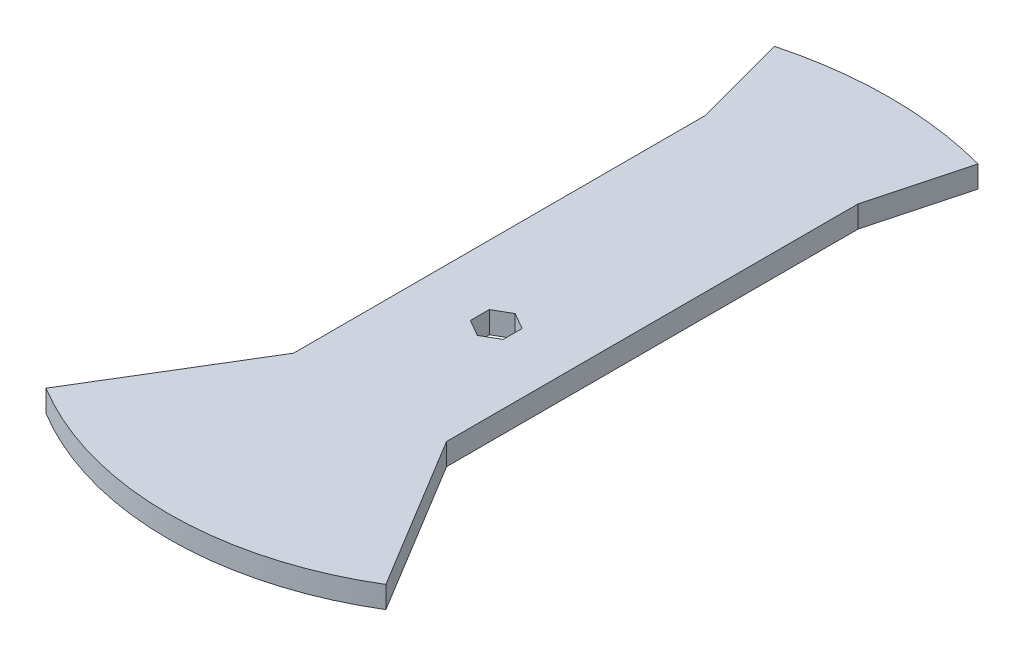
ISO-10303-21;
HEADER;
FILE_DESCRIPTION(('STEP AP214'),'2;1');
FILE_NAME('part.step','',(''),(''),'','','');
FILE_SCHEMA(('AUTOMOTIVE_DESIGN { 1 0 10303 214 1 1 1 1 }'));
ENDSEC;
DATA;
#1=APPLICATION_CONTEXT('core data for automotive mechanical design processes');
#2=APPLICATION_PROTOCOL_DEFINITION('international standard','automotive_design',2000,#1);
#3=PRODUCT_CONTEXT('',#1,'mechanical');
#4=PRODUCT('Part','Part','',(#3));
#5=PRODUCT_RELATED_PRODUCT_CATEGORY('part','',(#4));
#6=PRODUCT_DEFINITION_FORMATION('','',#4);
#7=PRODUCT_DEFINITION_CONTEXT('part definition',#1,'design');
#8=PRODUCT_DEFINITION('design','',#6,#7);
#9=PRODUCT_DEFINITION_SHAPE('','',#8);
#10=(LENGTH_UNIT() NAMED_UNIT(*) SI_UNIT(.MILLI.,.METRE.));
#11=(NAMED_UNIT(*) PLANE_ANGLE_UNIT() SI_UNIT($,.RADIAN.));
#12=(NAMED_UNIT(*) SI_UNIT($,.STERADIAN.) SOLID_ANGLE_UNIT());
#13=UNCERTAINTY_MEASURE_WITH_UNIT(LENGTH_MEASURE(1.E-05),#10,'distance_accuracy_value','');
#14=(GEOMETRIC_REPRESENTATION_CONTEXT(3) GLOBAL_UNCERTAINTY_ASSIGNED_CONTEXT((#13)) GLOBAL_UNIT_ASSIGNED_CONTEXT((#10,
#11,#12)) REPRESENTATION_CONTEXT('',''));
#15=CARTESIAN_POINT('',(0.,0.,0.));
#16=DIRECTION('',(0.,0.,1.));
#17=DIRECTION('',(1.,0.,0.));
#18=AXIS2_PLACEMENT_3D('',#15,#16,#17);
#19=CARTESIAN_POINT('',(0.,3.175,0.));
#20=DIRECTION('',(0.,-1.,0.));
#21=DIRECTION('',(0.,0.,-1.));
#22=AXIS2_PLACEMENT_3D('',#19,#20,#21);
#23=CYLINDRICAL_SURFACE('',#22,114.3);
#24=CARTESIAN_POINT('',(0.,-3.175,0.));
#25=DIRECTION('',(0.,1.,0.));
#26=DIRECTION('',(0.,0.,-1.));
#27=AXIS2_PLACEMENT_3D('',#24,#25,#26);
#28=CIRCLE('',#27,114.3);
#29=CARTESIAN_POINT('',(29.5830168552182,-3.175,-110.405321944841));
#30=VERTEX_POINT('',#29);
#31=CARTESIAN_POINT('',(-29.5830168552182,-3.175,-110.40532194484));
#32=VERTEX_POINT('',#31);
#33=EDGE_CURVE('E141',#30,#32,#28,.T.);
#34=ORIENTED_EDGE('',*,*,#33,.T.);
#35=DIRECTION('',(0.,-1.,0.));
#36=VECTOR('',#35,1.);
#37=CARTESIAN_POINT('',(-29.5830168552182,3.175,-110.40532194484));
#38=LINE('',#37,#36);
#39=CARTESIAN_POINT('',(-29.5830168552182,3.175,-110.40532194484));
#40=VERTEX_POINT('',#39);
#41=EDGE_CURVE('E11',#40,#32,#38,.T.);
#42=ORIENTED_EDGE('',*,*,#41,.F.);
#43=CARTESIAN_POINT('',(0.,3.175,0.));
#44=DIRECTION('',(0.,1.,0.));
#45=DIRECTION('',(0.,0.,-1.));
#46=AXIS2_PLACEMENT_3D('',#43,#44,#45);
#47=CIRCLE('',#46,114.3);
#48=CARTESIAN_POINT('',(29.5830168552182,3.175,-110.405321944841));
#49=VERTEX_POINT('',#48);
#50=EDGE_CURVE('E181',#49,#40,#47,.T.);
#51=ORIENTED_EDGE('',*,*,#50,.F.);
#52=DIRECTION('',(0.,-1.,0.));
#53=VECTOR('',#52,1.);
#54=CARTESIAN_POINT('',(29.5830168552182,3.175,-110.405321944841));
#55=LINE('',#54,#53);
#56=EDGE_CURVE('E199',#49,#30,#55,.T.);
#57=ORIENTED_EDGE('',*,*,#56,.T.);
#58=EDGE_LOOP('',(#34,#42,#51,#57));
#59=FACE_BOUND('',#58,.T.);
#60=ADVANCED_FACE('F35',(#59),#23,.T.);
#61=CARTESIAN_POINT('',(-29.5830168552182,3.175,-110.40532194484));
#62=DIRECTION('',(0.965925826289068,0.,-0.258819045102522));
#63=DIRECTION('',(-0.258819045102522,0.,-0.965925826289068));
#64=AXIS2_PLACEMENT_3D('',#61,#62,#63);
#65=PLANE('',#64);
#66=DIRECTION('',(0.258819045102522,0.,0.965925826289068));
#67=VECTOR('',#66,1.);
#68=CARTESIAN_POINT('',(-29.5830168552182,-3.175,-110.40532194484));
#69=LINE('',#68,#67);
#70=CARTESIAN_POINT('',(-22.225,-3.175,-82.944829198218));
#71=VERTEX_POINT('',#70);
#72=EDGE_CURVE('E202',#32,#71,#69,.T.);
#73=ORIENTED_EDGE('',*,*,#72,.T.);
#74=DIRECTION('',(0.,-1.,0.));
#75=VECTOR('',#74,1.);
#76=CARTESIAN_POINT('',(-22.225,3.175,-82.944829198218));
#77=LINE('',#76,#75);
#78=CARTESIAN_POINT('',(-22.225,3.175,-82.944829198218));
#79=VERTEX_POINT('',#78);
#80=EDGE_CURVE('E42',#79,#71,#77,.T.);
#81=ORIENTED_EDGE('',*,*,#80,.F.);
#82=DIRECTION('',(0.258819045102522,0.,0.965925826289068));
#83=VECTOR('',#82,1.);
#84=CARTESIAN_POINT('',(-29.5830168552182,3.175,-110.40532194484));
#85=LINE('',#84,#83);
#86=EDGE_CURVE('E184',#40,#79,#85,.T.);
#87=ORIENTED_EDGE('',*,*,#86,.F.);
#88=ORIENTED_EDGE('',*,*,#41,.T.);
#89=EDGE_LOOP('',(#73,#81,#87,#88));
#90=FACE_BOUND('',#89,.T.);
#91=ADVANCED_FACE('F257',(#90),#65,.F.);
#92=CARTESIAN_POINT('',(-22.225,3.175,-82.944829198218));
#93=DIRECTION('',(1.,0.,0.));
#94=DIRECTION('',(0.,0.,-1.));
#95=AXIS2_PLACEMENT_3D('',#92,#93,#94);
#96=PLANE('',#95);
#97=DIRECTION('',(0.,0.,1.));
#98=VECTOR('',#97,1.);
#99=CARTESIAN_POINT('',(-22.225,-3.175,-82.944829198218));
#100=LINE('',#99,#98);
#101=CARTESIAN_POINT('',(-22.225,-3.175,36.6590574958511));
#102=VERTEX_POINT('',#101);
#103=EDGE_CURVE('E204',#71,#102,#100,.T.);
#104=ORIENTED_EDGE('',*,*,#103,.T.);
#105=DIRECTION('',(0.,-1.,0.));
#106=VECTOR('',#105,1.);
#107=CARTESIAN_POINT('',(-22.225,3.175,36.6590574958511));
#108=LINE('',#107,#106);
#109=CARTESIAN_POINT('',(-22.225,3.175,36.6590574958511));
#110=VERTEX_POINT('',#109);
#111=EDGE_CURVE('E229',#110,#102,#108,.T.);
#112=ORIENTED_EDGE('',*,*,#111,.F.);
#113=DIRECTION('',(0.,0.,1.));
#114=VECTOR('',#113,1.);
#115=CARTESIAN_POINT('',(-22.225,3.175,-82.944829198218));
#116=LINE('',#115,#114);
#117=EDGE_CURVE('E187',#79,#110,#116,.T.);
#118=ORIENTED_EDGE('',*,*,#117,.F.);
#119=ORIENTED_EDGE('',*,*,#80,.T.);
#120=EDGE_LOOP('',(#104,#112,#118,#119));
#121=FACE_BOUND('',#120,.T.);
#122=ADVANCED_FACE('F236',(#121),#96,.F.);
#123=CARTESIAN_POINT('',(-22.225,3.175,36.6590574958511));
#124=DIRECTION('',(0.85512142026816,0.,0.51842777375307));
#125=DIRECTION('',(0.51842777375307,0.,-0.85512142026816));
#126=AXIS2_PLACEMENT_3D('',#123,#124,#125);
#127=PLANE('',#126);
#128=DIRECTION('',(-0.51842777375307,0.,0.85512142026816));
#129=VECTOR('',#128,1.);
#130=CARTESIAN_POINT('',(-22.225,-3.175,36.6590574958511));
#131=LINE('',#130,#129);
#132=CARTESIAN_POINT('',(-49.3802454499799,-3.175,81.4503152805423));
#133=VERTEX_POINT('',#132);
#134=EDGE_CURVE('E206',#102,#133,#131,.T.);
#135=ORIENTED_EDGE('',*,*,#134,.T.);
#136=DIRECTION('',(0.,-1.,0.));
#137=VECTOR('',#136,1.);
#138=CARTESIAN_POINT('',(-49.3802454499799,3.175,81.4503152805423));
#139=LINE('',#138,#137);
#140=CARTESIAN_POINT('',(-49.3802454499799,3.175,81.4503152805423));
#141=VERTEX_POINT('',#140);
#142=EDGE_CURVE('E226',#141,#133,#139,.T.);
#143=ORIENTED_EDGE('',*,*,#142,.F.);
#144=DIRECTION('',(-0.51842777375307,0.,0.85512142026816));
#145=VECTOR('',#144,1.);
#146=CARTESIAN_POINT('',(-22.225,3.175,36.6590574958511));
#147=LINE('',#146,#145);
#148=EDGE_CURVE('E189',#110,#141,#147,.T.);
#149=ORIENTED_EDGE('',*,*,#148,.F.);
#150=ORIENTED_EDGE('',*,*,#111,.T.);
#151=EDGE_LOOP('',(#135,#143,#149,#150));
#152=FACE_BOUND('',#151,.T.);
#153=ADVANCED_FACE('F245',(#152),#127,.F.);
#154=CARTESIAN_POINT('',(0.,3.175,0.));
#155=DIRECTION('',(0.,-1.,0.));
#156=DIRECTION('',(0.,0.,-1.));
#157=AXIS2_PLACEMENT_3D('',#154,#155,#156);
#158=CYLINDRICAL_SURFACE('',#157,95.25);
#159=CARTESIAN_POINT('',(0.,-3.175,0.));
#160=DIRECTION('',(0.,1.,0.));
#161=DIRECTION('',(0.,0.,1.));
#162=AXIS2_PLACEMENT_3D('',#159,#160,#161);
#163=CIRCLE('',#162,95.25);
#164=CARTESIAN_POINT('',(49.38024544998,-3.175,81.4503152805422));
#165=VERTEX_POINT('',#164);
#166=EDGE_CURVE('E208',#133,#165,#163,.T.);
#167=ORIENTED_EDGE('',*,*,#166,.T.);
#168=DIRECTION('',(0.,-1.,0.));
#169=VECTOR('',#168,1.);
#170=CARTESIAN_POINT('',(49.38024544998,3.175,81.4503152805422));
#171=LINE('',#170,#169);
#172=CARTESIAN_POINT('',(49.38024544998,3.175,81.4503152805422));
#173=VERTEX_POINT('',#172);
#174=EDGE_CURVE('E223',#173,#165,#171,.T.);
#175=ORIENTED_EDGE('',*,*,#174,.F.);
#176=CARTESIAN_POINT('',(0.,3.175,0.));
#177=DIRECTION('',(0.,1.,0.));
#178=DIRECTION('',(0.,0.,1.));
#179=AXIS2_PLACEMENT_3D('',#176,#177,#178);
#180=CIRCLE('',#179,95.25);
#181=EDGE_CURVE('E191',#141,#173,#180,.T.);
#182=ORIENTED_EDGE('',*,*,#181,.F.);
#183=ORIENTED_EDGE('',*,*,#142,.T.);
#184=EDGE_LOOP('',(#167,#175,#182,#183));
#185=FACE_BOUND('',#184,.T.);
#186=ADVANCED_FACE('F249',(#185),#158,.T.);
#187=CARTESIAN_POINT('',(22.225,3.175,36.659057495851));
#188=DIRECTION('',(-0.85512142026816,0.,0.51842777375307));
#189=DIRECTION('',(0.51842777375307,0.,0.85512142026816));
#190=AXIS2_PLACEMENT_3D('',#187,#188,#189);
#191=PLANE('',#190);
#192=DIRECTION('',(-0.51842777375307,0.,-0.85512142026816));
#193=VECTOR('',#192,1.);
#194=CARTESIAN_POINT('',(22.225,-3.175,36.659057495851));
#195=LINE('',#194,#193);
#196=CARTESIAN_POINT('',(22.225,-3.175,36.659057495851));
#197=VERTEX_POINT('',#196);
#198=EDGE_CURVE('E210',#165,#197,#195,.T.);
#199=ORIENTED_EDGE('',*,*,#198,.T.);
#200=DIRECTION('',(0.,-1.,0.));
#201=VECTOR('',#200,1.);
#202=CARTESIAN_POINT('',(22.225,3.175,36.659057495851));
#203=LINE('',#202,#201);
#204=CARTESIAN_POINT('',(22.225,3.175,36.659057495851));
#205=VERTEX_POINT('',#204);
#206=EDGE_CURVE('E220',#205,#197,#203,.T.);
#207=ORIENTED_EDGE('',*,*,#206,.F.);
#208=DIRECTION('',(-0.51842777375307,0.,-0.85512142026816));
#209=VECTOR('',#208,1.);
#210=CARTESIAN_POINT('',(22.225,3.175,36.659057495851));
#211=LINE('',#210,#209);
#212=EDGE_CURVE('E193',#173,#205,#211,.T.);
#213=ORIENTED_EDGE('',*,*,#212,.F.);
#214=ORIENTED_EDGE('',*,*,#174,.T.);
#215=EDGE_LOOP('',(#199,#207,#213,#214));
#216=FACE_BOUND('',#215,.T.);
#217=ADVANCED_FACE('F270',(#216),#191,.F.);
#218=CARTESIAN_POINT('',(22.225,3.175,-82.944829198218));
#219=DIRECTION('',(-1.,0.,0.));
#220=DIRECTION('',(0.,0.,1.));
#221=AXIS2_PLACEMENT_3D('',#218,#219,#220);
#222=PLANE('',#221);
#223=DIRECTION('',(0.,0.,-1.));
#224=VECTOR('',#223,1.);
#225=CARTESIAN_POINT('',(22.225,-3.175,-82.944829198218));
#226=LINE('',#225,#224);
#227=CARTESIAN_POINT('',(22.225,-3.175,-82.944829198218));
#228=VERTEX_POINT('',#227);
#229=EDGE_CURVE('E212',#197,#228,#226,.T.);
#230=ORIENTED_EDGE('',*,*,#229,.T.);
#231=DIRECTION('',(0.,-1.,0.));
#232=VECTOR('',#231,1.);
#233=CARTESIAN_POINT('',(22.225,3.175,-82.944829198218));
#234=LINE('',#233,#232);
#235=CARTESIAN_POINT('',(22.225,3.175,-82.944829198218));
#236=VERTEX_POINT('',#235);
#237=EDGE_CURVE('E217',#236,#228,#234,.T.);
#238=ORIENTED_EDGE('',*,*,#237,.F.);
#239=DIRECTION('',(0.,0.,-1.));
#240=VECTOR('',#239,1.);
#241=CARTESIAN_POINT('',(22.225,3.175,-82.944829198218));
#242=LINE('',#241,#240);
#243=EDGE_CURVE('E195',#205,#236,#242,.T.);
#244=ORIENTED_EDGE('',*,*,#243,.F.);
#245=ORIENTED_EDGE('',*,*,#206,.T.);
#246=EDGE_LOOP('',(#230,#238,#244,#245));
#247=FACE_BOUND('',#246,.T.);
#248=ADVANCED_FACE('F268',(#247),#222,.F.);
#249=CARTESIAN_POINT('',(22.225,3.175,-82.944829198218));
#250=DIRECTION('',(-0.965925826289068,0.,-0.258819045102521));
#251=DIRECTION('',(-0.258819045102521,0.,0.965925826289068));
#252=AXIS2_PLACEMENT_3D('',#249,#250,#251);
#253=PLANE('',#252);
#254=DIRECTION('',(0.258819045102521,0.,-0.965925826289068));
#255=VECTOR('',#254,1.);
#256=CARTESIAN_POINT('',(22.225,-3.175,-82.944829198218));
#257=LINE('',#256,#255);
#258=EDGE_CURVE('E185',#228,#30,#257,.T.);
#259=ORIENTED_EDGE('',*,*,#258,.T.);
#260=ORIENTED_EDGE('',*,*,#56,.F.);
#261=DIRECTION('',(0.258819045102521,0.,-0.965925826289068));
#262=VECTOR('',#261,1.);
#263=CARTESIAN_POINT('',(22.225,3.175,-82.944829198218));
#264=LINE('',#263,#262);
#265=EDGE_CURVE('E197',#236,#49,#264,.T.);
#266=ORIENTED_EDGE('',*,*,#265,.F.);
#267=ORIENTED_EDGE('',*,*,#237,.T.);
#268=EDGE_LOOP('',(#259,#260,#266,#267));
#269=FACE_BOUND('',#268,.T.);
#270=ADVANCED_FACE('F263',(#269),#253,.F.);
#271=CARTESIAN_POINT('',(0.,3.175,0.));
#272=DIRECTION('',(0.,-1.,0.));
#273=DIRECTION('',(0.,0.,-1.));
#274=AXIS2_PLACEMENT_3D('',#271,#272,#273);
#275=PLANE('',#274);
#276=DIRECTION('',(0.,0.,-1.));
#277=VECTOR('',#276,1.);
#278=CARTESIAN_POINT('',(4.7625,3.175,2.74963065701559));
#279=LINE('',#278,#277);
#280=CARTESIAN_POINT('',(4.7625,3.175,2.74963065701559));
#281=VERTEX_POINT('',#280);
#282=CARTESIAN_POINT('',(4.7625,3.175,-2.7496306570156));
#283=VERTEX_POINT('',#282);
#284=EDGE_CURVE('E155',#281,#283,#279,.T.);
#285=ORIENTED_EDGE('',*,*,#284,.F.);
#286=DIRECTION('',(0.866025403784439,0.,-0.5));
#287=VECTOR('',#286,1.);
#288=CARTESIAN_POINT('',(0.,3.175,5.49926131403119));
#289=LINE('',#288,#287);
#290=CARTESIAN_POINT('',(0.,3.175,5.49926131403119));
#291=VERTEX_POINT('',#290);
#292=EDGE_CURVE('E49',#291,#281,#289,.T.);
#293=ORIENTED_EDGE('',*,*,#292,.F.);
#294=DIRECTION('',(0.866025403784439,0.,0.5));
#295=VECTOR('',#294,1.);
#296=CARTESIAN_POINT('',(-4.7625,3.175,2.74963065701559));
#297=LINE('',#296,#295);
#298=CARTESIAN_POINT('',(-4.7625,3.175,2.74963065701559));
#299=VERTEX_POINT('',#298);
#300=EDGE_CURVE('E147',#299,#291,#297,.T.);
#301=ORIENTED_EDGE('',*,*,#300,.F.);
#302=DIRECTION('',(0.,0.,1.));
#303=VECTOR('',#302,1.);
#304=CARTESIAN_POINT('',(-4.7625,3.175,-2.7496306570156));
#305=LINE('',#304,#303);
#306=CARTESIAN_POINT('',(-4.7625,3.175,-2.7496306570156));
#307=VERTEX_POINT('',#306);
#308=EDGE_CURVE('E168',#307,#299,#305,.T.);
#309=ORIENTED_EDGE('',*,*,#308,.F.);
#310=DIRECTION('',(-0.866025403784439,0.,0.5));
#311=VECTOR('',#310,1.);
#312=CARTESIAN_POINT('',(0.,3.175,-5.49926131403119));
#313=LINE('',#312,#311);
#314=CARTESIAN_POINT('',(0.,3.175,-5.49926131403119));
#315=VERTEX_POINT('',#314);
#316=EDGE_CURVE('E165',#315,#307,#313,.T.);
#317=ORIENTED_EDGE('',*,*,#316,.F.);
#318=DIRECTION('',(-0.866025403784439,0.,-0.5));
#319=VECTOR('',#318,1.);
#320=CARTESIAN_POINT('',(4.7625,3.175,-2.7496306570156));
#321=LINE('',#320,#319);
#322=EDGE_CURVE('E162',#283,#315,#321,.T.);
#323=ORIENTED_EDGE('',*,*,#322,.F.);
#324=EDGE_LOOP('',(#285,#293,#301,#309,#317,#323));
#325=FACE_BOUND('',#324,.T.);
#326=ORIENTED_EDGE('',*,*,#50,.T.);
#327=ORIENTED_EDGE('',*,*,#86,.T.);
#328=ORIENTED_EDGE('',*,*,#117,.T.);
#329=ORIENTED_EDGE('',*,*,#148,.T.);
#330=ORIENTED_EDGE('',*,*,#181,.T.);
#331=ORIENTED_EDGE('',*,*,#212,.T.);
#332=ORIENTED_EDGE('',*,*,#243,.T.);
#333=ORIENTED_EDGE('',*,*,#265,.T.);
#334=EDGE_LOOP('',(#326,#327,#328,#329,#330,#331,#332,#333));
#335=FACE_BOUND('',#334,.T.);
#336=ADVANCED_FACE('F253',(#325,#335),#275,.F.);
#337=CARTESIAN_POINT('',(0.,-3.175,0.));
#338=DIRECTION('',(0.,-1.,0.));
#339=DIRECTION('',(0.,0.,-1.));
#340=AXIS2_PLACEMENT_3D('',#337,#338,#339);
#341=PLANE('',#340);
#342=DIRECTION('',(0.866025403784439,0.,-0.5));
#343=VECTOR('',#342,1.);
#344=CARTESIAN_POINT('',(0.,-3.175,5.49926131403119));
#345=LINE('',#344,#343);
#346=CARTESIAN_POINT('',(0.,-3.175,5.49926131403119));
#347=VERTEX_POINT('',#346);
#348=CARTESIAN_POINT('',(4.7625,-3.175,2.74963065701559));
#349=VERTEX_POINT('',#348);
#350=EDGE_CURVE('E145',#347,#349,#345,.T.);
#351=ORIENTED_EDGE('',*,*,#350,.T.);
#352=DIRECTION('',(0.,0.,-1.));
#353=VECTOR('',#352,1.);
#354=CARTESIAN_POINT('',(4.7625,-3.175,2.74963065701559));
#355=LINE('',#354,#353);
#356=CARTESIAN_POINT('',(4.7625,-3.175,-2.7496306570156));
#357=VERTEX_POINT('',#356);
#358=EDGE_CURVE('E134',#349,#357,#355,.T.);
#359=ORIENTED_EDGE('',*,*,#358,.T.);
#360=DIRECTION('',(-0.866025403784439,0.,-0.5));
#361=VECTOR('',#360,1.);
#362=CARTESIAN_POINT('',(4.7625,-3.175,-2.7496306570156));
#363=LINE('',#362,#361);
#364=CARTESIAN_POINT('',(0.,-3.175,-5.49926131403119));
#365=VERTEX_POINT('',#364);
#366=EDGE_CURVE('E391',#357,#365,#363,.T.);
#367=ORIENTED_EDGE('',*,*,#366,.T.);
#368=DIRECTION('',(-0.866025403784439,0.,0.5));
#369=VECTOR('',#368,1.);
#370=CARTESIAN_POINT('',(0.,-3.175,-5.49926131403119));
#371=LINE('',#370,#369);
#372=CARTESIAN_POINT('',(-4.7625,-3.175,-2.7496306570156));
#373=VERTEX_POINT('',#372);
#374=EDGE_CURVE('E396',#365,#373,#371,.T.);
#375=ORIENTED_EDGE('',*,*,#374,.T.);
#376=DIRECTION('',(0.,0.,1.));
#377=VECTOR('',#376,1.);
#378=CARTESIAN_POINT('',(-4.7625,-3.175,-2.7496306570156));
#379=LINE('',#378,#377);
#380=CARTESIAN_POINT('',(-4.7625,-3.175,2.74963065701559));
#381=VERTEX_POINT('',#380);
#382=EDGE_CURVE('E157',#373,#381,#379,.T.);
#383=ORIENTED_EDGE('',*,*,#382,.T.);
#384=DIRECTION('',(0.866025403784439,0.,0.5));
#385=VECTOR('',#384,1.);
#386=CARTESIAN_POINT('',(-4.7625,-3.175,2.74963065701559));
#387=LINE('',#386,#385);
#388=EDGE_CURVE('E153',#381,#347,#387,.T.);
#389=ORIENTED_EDGE('',*,*,#388,.T.);
#390=EDGE_LOOP('',(#351,#359,#367,#375,#383,#389));
#391=FACE_BOUND('',#390,.T.);
#392=ORIENTED_EDGE('',*,*,#33,.F.);
#393=ORIENTED_EDGE('',*,*,#258,.F.);
#394=ORIENTED_EDGE('',*,*,#229,.F.);
#395=ORIENTED_EDGE('',*,*,#198,.F.);
#396=ORIENTED_EDGE('',*,*,#166,.F.);
#397=ORIENTED_EDGE('',*,*,#134,.F.);
#398=ORIENTED_EDGE('',*,*,#103,.F.);
#399=ORIENTED_EDGE('',*,*,#72,.F.);
#400=EDGE_LOOP('',(#392,#393,#394,#395,#396,#397,#398,#399));
#401=FACE_BOUND('',#400,.T.);
#402=ADVANCED_FACE('F150',(#391,#401),#341,.T.);
#403=CARTESIAN_POINT('',(0.,-3.176,5.49926131403119));
#404=DIRECTION('',(0.5,0.,0.866025403784439));
#405=DIRECTION('',(0.866025403784439,0.,-0.5));
#406=AXIS2_PLACEMENT_3D('',#403,#404,#405);
#407=PLANE('',#406);
#408=DIRECTION('',(0.,1.,0.));
#409=VECTOR('',#408,1.);
#410=CARTESIAN_POINT('',(0.,-3.176,5.49926131403119));
#411=LINE('',#410,#409);
#412=EDGE_CURVE('E142',#347,#291,#411,.T.);
#413=ORIENTED_EDGE('',*,*,#412,.T.);
#414=ORIENTED_EDGE('',*,*,#292,.T.);
#415=DIRECTION('',(0.,1.,0.));
#416=VECTOR('',#415,1.);
#417=CARTESIAN_POINT('',(4.7625,-3.176,2.74963065701559));
#418=LINE('',#417,#416);
#419=EDGE_CURVE('E136',#349,#281,#418,.T.);
#420=ORIENTED_EDGE('',*,*,#419,.F.);
#421=ORIENTED_EDGE('',*,*,#350,.F.);
#422=EDGE_LOOP('',(#413,#414,#420,#421));
#423=FACE_BOUND('',#422,.T.);
#424=ADVANCED_FACE('F144',(#423),#407,.F.);
#425=CARTESIAN_POINT('',(-4.7625,-3.176,2.74963065701559));
#426=DIRECTION('',(-0.5,0.,0.866025403784439));
#427=DIRECTION('',(0.866025403784439,0.,0.5));
#428=AXIS2_PLACEMENT_3D('',#425,#426,#427);
#429=PLANE('',#428);
#430=DIRECTION('',(0.,1.,0.));
#431=VECTOR('',#430,1.);
#432=CARTESIAN_POINT('',(-4.7625,-3.176,2.74963065701559));
#433=LINE('',#432,#431);
#434=EDGE_CURVE('E174',#381,#299,#433,.T.);
#435=ORIENTED_EDGE('',*,*,#434,.T.);
#436=ORIENTED_EDGE('',*,*,#300,.T.);
#437=ORIENTED_EDGE('',*,*,#412,.F.);
#438=ORIENTED_EDGE('',*,*,#388,.F.);
#439=EDGE_LOOP('',(#435,#436,#437,#438));
#440=FACE_BOUND('',#439,.T.);
#441=ADVANCED_FACE('F337',(#440),#429,.F.);
#442=CARTESIAN_POINT('',(-4.7625,-3.176,-2.7496306570156));
#443=DIRECTION('',(-1.,0.,0.));
#444=DIRECTION('',(0.,0.,1.));
#445=AXIS2_PLACEMENT_3D('',#442,#443,#444);
#446=PLANE('',#445);
#447=DIRECTION('',(0.,1.,0.));
#448=VECTOR('',#447,1.);
#449=CARTESIAN_POINT('',(-4.7625,-3.176,-2.7496306570156));
#450=LINE('',#449,#448);
#451=EDGE_CURVE('E176',#373,#307,#450,.T.);
#452=ORIENTED_EDGE('',*,*,#451,.T.);
#453=ORIENTED_EDGE('',*,*,#308,.T.);
#454=ORIENTED_EDGE('',*,*,#434,.F.);
#455=ORIENTED_EDGE('',*,*,#382,.F.);
#456=EDGE_LOOP('',(#452,#453,#454,#455));
#457=FACE_BOUND('',#456,.T.);
#458=ADVANCED_FACE('F346',(#457),#446,.F.);
#459=CARTESIAN_POINT('',(0.,-3.176,-5.49926131403119));
#460=DIRECTION('',(-0.5,0.,-0.866025403784439));
#461=DIRECTION('',(-0.866025403784439,0.,0.5));
#462=AXIS2_PLACEMENT_3D('',#459,#460,#461);
#463=PLANE('',#462);
#464=DIRECTION('',(0.,1.,0.));
#465=VECTOR('',#464,1.);
#466=CARTESIAN_POINT('',(0.,-3.176,-5.49926131403119));
#467=LINE('',#466,#465);
#468=EDGE_CURVE('E178',#365,#315,#467,.T.);
#469=ORIENTED_EDGE('',*,*,#468,.T.);
#470=ORIENTED_EDGE('',*,*,#316,.T.);
#471=ORIENTED_EDGE('',*,*,#451,.F.);
#472=ORIENTED_EDGE('',*,*,#374,.F.);
#473=EDGE_LOOP('',(#469,#470,#471,#472));
#474=FACE_BOUND('',#473,.T.);
#475=ADVANCED_FACE('F356',(#474),#463,.F.);
#476=CARTESIAN_POINT('',(4.7625,-3.176,-2.7496306570156));
#477=DIRECTION('',(0.5,0.,-0.866025403784439));
#478=DIRECTION('',(-0.866025403784439,0.,-0.5));
#479=AXIS2_PLACEMENT_3D('',#476,#477,#478);
#480=PLANE('',#479);
#481=DIRECTION('',(0.,1.,0.));
#482=VECTOR('',#481,1.);
#483=CARTESIAN_POINT('',(4.7625,-3.176,-2.7496306570156));
#484=LINE('',#483,#482);
#485=EDGE_CURVE('E57',#357,#283,#484,.T.);
#486=ORIENTED_EDGE('',*,*,#485,.T.);
#487=ORIENTED_EDGE('',*,*,#322,.T.);
#488=ORIENTED_EDGE('',*,*,#468,.F.);
#489=ORIENTED_EDGE('',*,*,#366,.F.);
#490=EDGE_LOOP('',(#486,#487,#488,#489));
#491=FACE_BOUND('',#490,.T.);
#492=ADVANCED_FACE('F366',(#491),#480,.F.);
#493=CARTESIAN_POINT('',(4.7625,-3.176,2.74963065701559));
#494=DIRECTION('',(1.,0.,0.));
#495=DIRECTION('',(0.,0.,-1.));
#496=AXIS2_PLACEMENT_3D('',#493,#494,#495);
#497=PLANE('',#496);
#498=ORIENTED_EDGE('',*,*,#419,.T.);
#499=ORIENTED_EDGE('',*,*,#284,.T.);
#500=ORIENTED_EDGE('',*,*,#485,.F.);
#501=ORIENTED_EDGE('',*,*,#358,.F.);
#502=EDGE_LOOP('',(#498,#499,#500,#501));
#503=FACE_BOUND('',#502,.T.);
#504=ADVANCED_FACE('F135',(#503),#497,.F.);
#505=CLOSED_SHELL('',(#60,#91,#122,#153,#186,#217,#248,#270,#336,#402,#424,#441,#458,#475,#492,#504));
#506=MANIFOLD_SOLID_BREP('B2',#505);
#507=ADVANCED_BREP_SHAPE_REPRESENTATION('',(#18,#506),#14);
#508=SHAPE_DEFINITION_REPRESENTATION(#9,#507);
ENDSEC;
END-ISO-10303-21;
